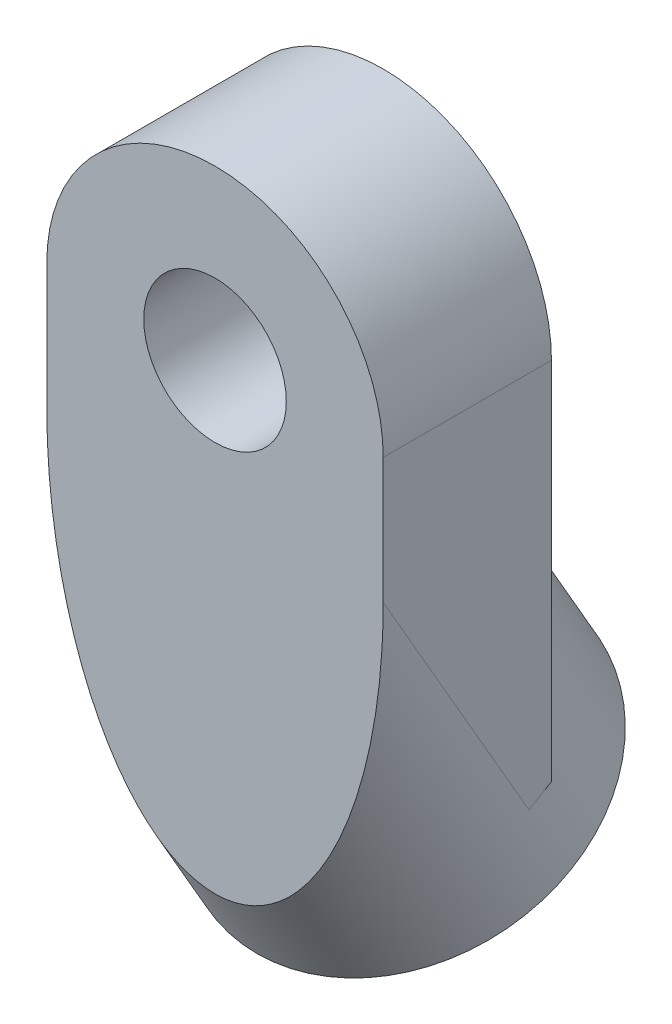
ISO-10303-21;
HEADER;
FILE_DESCRIPTION(('STEP AP214'),'2;1');
FILE_NAME('part.step','',(''),(''),'','','');
FILE_SCHEMA(('AUTOMOTIVE_DESIGN { 1 0 10303 214 1 1 1 1 }'));
ENDSEC;
DATA;
#1=APPLICATION_CONTEXT('core data for automotive mechanical design processes');
#2=APPLICATION_PROTOCOL_DEFINITION('international standard','automotive_design',2000,#1);
#3=PRODUCT_CONTEXT('',#1,'mechanical');
#4=PRODUCT('Part','Part','',(#3));
#5=PRODUCT_RELATED_PRODUCT_CATEGORY('part','',(#4));
#6=PRODUCT_DEFINITION_FORMATION('','',#4);
#7=PRODUCT_DEFINITION_CONTEXT('part definition',#1,'design');
#8=PRODUCT_DEFINITION('design','',#6,#7);
#9=PRODUCT_DEFINITION_SHAPE('','',#8);
#10=(LENGTH_UNIT() NAMED_UNIT(*) SI_UNIT(.MILLI.,.METRE.));
#11=(NAMED_UNIT(*) PLANE_ANGLE_UNIT() SI_UNIT($,.RADIAN.));
#12=(NAMED_UNIT(*) SI_UNIT($,.STERADIAN.) SOLID_ANGLE_UNIT());
#13=UNCERTAINTY_MEASURE_WITH_UNIT(LENGTH_MEASURE(1.E-05),#10,'distance_accuracy_value','');
#14=(GEOMETRIC_REPRESENTATION_CONTEXT(3) GLOBAL_UNCERTAINTY_ASSIGNED_CONTEXT((#13)) GLOBAL_UNIT_ASSIGNED_CONTEXT((#10,
#11,#12)) REPRESENTATION_CONTEXT('',''));
#15=CARTESIAN_POINT('',(0.,0.,0.));
#16=DIRECTION('',(0.,0.,1.));
#17=DIRECTION('',(1.,0.,0.));
#18=AXIS2_PLACEMENT_3D('',#15,#16,#17);
#19=CARTESIAN_POINT('',(0.,-6.48160973273944,-7.82352262806237));
#20=DIRECTION('',(0.,0.866025403784438,0.5));
#21=DIRECTION('',(0.,-0.5,0.866025403784439));
#22=AXIS2_PLACEMENT_3D('',#19,#20,#21);
#23=CYLINDRICAL_SURFACE('',#22,12.7);
#24=CARTESIAN_POINT('',(0.,-6.48160973273944,-7.82352262806237));
#25=DIRECTION('',(0.,-0.866025403784438,-0.5));
#26=DIRECTION('',(0.,0.5,-0.866025403784438));
#27=AXIS2_PLACEMENT_3D('',#24,#25,#26);
#28=CIRCLE('',#27,12.7);
#29=CARTESIAN_POINT('',(0.,-0.13160973273944,-18.8220452561247));
#30=VERTEX_POINT('',#29);
#31=EDGE_CURVE('E107',#30,#30,#28,.T.);
#32=ORIENTED_EDGE('',*,*,#31,.F.);
#33=EDGE_LOOP('',(#32));
#34=FACE_BOUND('',#33,.T.);
#35=CARTESIAN_POINT('',(0.,-3.92939367483299,-6.35));
#36=DIRECTION('',(0.,0.,1.));
#37=DIRECTION('',(0.,-1.,0.));
#38=AXIS2_PLACEMENT_3D('',#35,#36,#37);
#39=ELLIPSE('',#38,25.4,12.7);
#40=CARTESIAN_POINT('',(-9.73055161849106,12.3931508816853,-6.35));
#41=VERTEX_POINT('',#40);
#42=CARTESIAN_POINT('',(-12.5471098798506,0.,-6.35));
#43=VERTEX_POINT('',#42);
#44=EDGE_CURVE('E249',#41,#43,#39,.T.);
#45=ORIENTED_EDGE('',*,*,#44,.F.);
#46=CARTESIAN_POINT('',(-4.71033769559164,15.760829647601,-2.11427145520557));
#47=CARTESIAN_POINT('',(-9.3500188090878,17.6138166245747,-4.53215426220502));
#48=CARTESIAN_POINT('',(-10.9907879563805,12.3158326297928,-4.31861027030312));
#49=CARTESIAN_POINT('',(-4.66480935233403,15.7426480037525,-2.25607684625016));
#50=CARTESIAN_POINT('',(-9.22047598769822,17.5414678862771,-4.70719084140343));
#51=CARTESIAN_POINT('',(-10.8845551554597,12.3270716351925,-4.52397033300249));
#52=CARTESIAN_POINT('',(-4.61729978227359,15.7239778387766,-2.39649452106062));
#53=CARTESIAN_POINT('',(-9.08859857805098,17.4687020364745,-4.87938504399554));
#54=CARTESIAN_POINT('',(-10.7736994919871,12.3371121235453,-4.72705138786155));
#55=CARTESIAN_POINT('',(-4.51829924721504,15.6858160990841,-2.67434319971112));
#56=CARTESIAN_POINT('',(-8.82191939606875,17.3238109959776,-5.21571524870859));
#57=CARTESIAN_POINT('',(-10.5426982435122,12.3549892867223,-5.12840152233819));
#58=CARTESIAN_POINT('',(-4.46680793544057,15.6663244528908,-2.81177394207608));
#59=CARTESIAN_POINT('',(-8.68714583902998,17.2516701468663,-5.37997893006667));
#60=CARTESIAN_POINT('',(-10.4225518493649,12.3628257693199,-5.32667018085616));
#61=CARTESIAN_POINT('',(-4.30611432486,15.6067700492994,-3.2198188508936));
#62=CARTESIAN_POINT('',(-8.28049528887311,17.0379049566083,-5.8587359847489));
#63=CARTESIAN_POINT('',(-10.0476000913328,12.3833459959327,-5.91466891850728));
#64=CARTESIAN_POINT('',(-4.19088889029374,15.5657077333361,-3.48557106919732));
#65=CARTESIAN_POINT('',(-8.00135743649745,16.8961594820296,-6.16580628335845));
#66=CARTESIAN_POINT('',(-9.77874074401754,12.3929936042705,-6.29670210873674));
#67=CARTESIAN_POINT('',(-3.94264342158998,15.4817783554193,-4.00475951743109));
#68=CARTESIAN_POINT('',(-7.42618828043631,16.6179084012312,-6.75403186851694));
#69=CARTESIAN_POINT('',(-9.1995013170445,12.405785747898,-7.04156512632309));
#70=CARTESIAN_POINT('',(-3.80941671213504,15.4388950336906,-4.25799740804109));
#71=CARTESIAN_POINT('',(-7.12994902814984,16.4811257004839,-7.03596818750109));
#72=CARTESIAN_POINT('',(-8.88863899497933,12.4088464699039,-7.40409087337854));
#73=CARTESIAN_POINT('',(-3.52604051870766,15.353416413283,-4.74487346784235));
#74=CARTESIAN_POINT('',(-6.52224331382657,16.2175906140569,-7.56937642180235));
#75=CARTESIAN_POINT('',(-8.22742787699442,12.409780402126,-8.09985919003638));
#76=CARTESIAN_POINT('',(-3.37591031714585,15.3108208440117,-4.97853344982408));
#77=CARTESIAN_POINT('',(-6.21072347010092,16.0904095650642,-7.82196372671173));
#78=CARTESIAN_POINT('',(-7.87712407336615,12.4076594671815,-8.43313436946408));
#79=CARTESIAN_POINT('',(-3.02253444365894,15.2182890169732,-5.4719079638147));
#80=CARTESIAN_POINT('',(-5.50002748537113,15.8224343974878,-8.34719458565854));
#81=CARTESIAN_POINT('',(-7.05258036850595,12.3989491044213,-9.13579984787295));
#82=CARTESIAN_POINT('',(-2.8149172458731,15.1688402279992,-5.72577137924307));
#83=CARTESIAN_POINT('',(-5.09433225766359,15.683343349462,-8.61508186066678));
#84=CARTESIAN_POINT('',(-6.56814024024492,12.3914668031595,-9.49661047976246));
#85=CARTESIAN_POINT('',(-2.37407090860399,15.0768623111116,-6.18644765555731));
#86=CARTESIAN_POINT('',(-4.2556260582803,15.4315524614396,-9.09500944061571));
#87=CARTESIAN_POINT('',(-5.53949878686779,12.3742219941965,-10.150452463801));
#88=CARTESIAN_POINT('',(-2.14094523661842,15.0343068471481,-6.39344085241513));
#89=CARTESIAN_POINT('',(-3.82170830445291,15.3177164813835,-9.30935374707964));
#90=CARTESIAN_POINT('',(-4.99553888591127,12.3644685294358,-10.443743676303));
#91=CARTESIAN_POINT('',(-1.6941915142035,14.9668776396867,-6.71624881522884));
#92=CARTESIAN_POINT('',(-3.0048693398018,15.1407073859371,-9.64060877172266));
#93=CARTESIAN_POINT('',(-3.95311353275647,12.3475207796026,-10.9007044229777));
#94=CARTESIAN_POINT('',(-1.48446513837053,14.9402054421916,-6.84173107168085));
#95=CARTESIAN_POINT('',(-2.62638290015753,15.0716792679719,-9.76892789562338));
#96=CARTESIAN_POINT('',(-3.46375198821261,12.340179786846,-11.0781483587923));
#97=CARTESIAN_POINT('',(-1.16070952942064,14.9076967092268,-6.99346747976409));
#98=CARTESIAN_POINT('',(-2.0471584062177,14.9883331019495,-9.92341577144674));
#99=CARTESIAN_POINT('',(-2.70832223459052,12.3308847245414,-11.2926147283601));
#100=CARTESIAN_POINT('',(-1.05131636180754,14.8981131105382,-7.03795289039113));
#101=CARTESIAN_POINT('',(-1.85263894771915,14.9639249808831,-9.96856674870955));
#102=CARTESIAN_POINT('',(-2.45307151068981,12.328073351361,-11.3554696838678));
#103=CARTESIAN_POINT('',(-0.830075308764096,14.8816829954003,-7.11398329508248));
#104=CARTESIAN_POINT('',(-1.46073522732757,14.9222527103613,-10.0455677648978));
#105=CARTESIAN_POINT('',(-1.93684238730897,12.3231855883868,-11.462875142464));
#106=CARTESIAN_POINT('',(-0.718228566408454,14.8748352317912,-7.14553418565822));
#107=CARTESIAN_POINT('',(-1.2631346432319,14.904936531915,-10.0775143333029));
#108=CARTESIAN_POINT('',(-1.67586665500344,12.3211088637453,-11.5074339862887));
#109=CARTESIAN_POINT('',(-0.505522834831185,14.8646808796553,-7.19223928179345));
#110=CARTESIAN_POINT('',(-0.888300134198296,14.8793298070923,-10.1247272180459));
#111=CARTESIAN_POINT('',(-1.17955328122804,12.3180060208047,-11.5733877971141));
#112=CARTESIAN_POINT('',(-0.404839136592086,14.8610631630283,-7.20883606977078));
#113=CARTESIAN_POINT('',(-0.711132139366061,14.8702222998375,-10.1415040256966));
#114=CARTESIAN_POINT('',(-0.94462465203126,12.3168881640456,-11.5968208966282));
#115=CARTESIAN_POINT('',(-0.202773320352367,14.856227879363,-7.23100643718077));
#116=CARTESIAN_POINT('',(-0.35606895402545,14.8580678883356,-10.1638891610768));
#117=CARTESIAN_POINT('',(-0.473137747504206,12.315390567966,-11.6281222911971));
#118=CARTESIAN_POINT('',(-0.101391056044541,14.8550108314613,-7.23657763236637));
#119=CARTESIAN_POINT('',(-0.177997320138184,14.8550101600694,-10.1695174288209));
#120=CARTESIAN_POINT('',(-0.23657913079045,12.3150109882957,-11.6359872196878));
#121=CARTESIAN_POINT('',(0.120844061844924,14.8550116673593,-7.23657460564745));
#122=CARTESIAN_POINT('',(0.212148123406552,14.8550124675654,-10.1695134618562));
#123=CARTESIAN_POINT('',(0.281969477661819,12.3150114804344,-11.6359830179198));
#124=CARTESIAN_POINT('',(0.241700612642234,14.8567415203758,-7.22865693144764));
#125=CARTESIAN_POINT('',(0.424470037633381,14.8593592852235,-10.161512740725));
#126=CARTESIAN_POINT('',(0.563968096247139,12.3155512724541,-11.6248056193056));
#127=CARTESIAN_POINT('',(0.482325368486037,14.8636021678432,-7.19718573370158));
#128=CARTESIAN_POINT('',(0.847450267656255,14.8766121524747,-10.1297325648991));
#129=CARTESIAN_POINT('',(1.12542585971853,12.3176720415859,-11.5803715179889));
#130=CARTESIAN_POINT('',(0.602092951641436,14.8687347953492,-7.17362378266345));
#131=CARTESIAN_POINT('',(1.05840467528961,14.8895472513431,-10.1058995763168));
#132=CARTESIAN_POINT('',(1.40488355352523,12.3192535798776,-11.5471029148668));
#133=CARTESIAN_POINT('',(0.839624355695914,14.882236953042,-7.11140976282716));
#134=CARTESIAN_POINT('',(1.47758583845933,14.9236507952822,-10.042980665647));
#135=CARTESIAN_POINT('',(1.95912349631825,12.3233474635332,-11.4592387171563));
#136=CARTESIAN_POINT('',(0.957384465011841,14.8906119164125,-7.07273236403171));
#137=CARTESIAN_POINT('',(1.68608462902913,14.9448796269528,-10.0037830493633));
#138=CARTESIAN_POINT('',(2.23389708494462,12.3258613709699,-11.404607323378));
#139=CARTESIAN_POINT('',(1.18984741096279,14.9103331795543,-6.98118330208817));
#140=CARTESIAN_POINT('',(2.09901663990741,14.9950544802912,-9.91096534271956));
#141=CARTESIAN_POINT('',(2.77631062565951,12.3316448325227,-11.2752539864692));
#142=CARTESIAN_POINT('',(1.30454865017269,14.9216809996024,-6.92830437613103));
#143=CARTESIAN_POINT('',(2.3036959484259,15.0240690120957,-9.85721782737466));
#144=CARTESIAN_POINT('',(3.0439468504226,12.3349147731627,-11.2005217635354));
#145=CARTESIAN_POINT('',(1.52904777330116,14.9468927266814,-6.81004367980378));
#146=CARTESIAN_POINT('',(2.70615926291516,15.088863791374,-9.73689605878003));
#147=CARTESIAN_POINT('',(3.56777813768324,12.3419550042145,-11.0333199166134));
#148=CARTESIAN_POINT('',(1.63888202999367,14.9607315633099,-6.7447861680207));
#149=CARTESIAN_POINT('',(2.90420900536596,15.1246539503386,-9.67030449799901));
#150=CARTESIAN_POINT('',(3.82405806998595,12.3457202166542,-10.9410265484126));
#151=CARTESIAN_POINT('',(1.85433289396668,14.9906452409184,-6.60260308027123));
#152=CARTESIAN_POINT('',(3.29504195202557,15.2025263992439,-9.52497541160767));
#153=CARTESIAN_POINT('',(4.32677675258547,12.3535345015855,-10.7398413857879));
#154=CARTESIAN_POINT('',(1.95994783859798,15.0067209523833,-6.52567296082361));
#155=CARTESIAN_POINT('',(3.48799419931685,15.2446936346676,-9.44607654069191));
#156=CARTESIAN_POINT('',(4.57321162336753,12.357583684279,-10.6309431279444));
#157=CARTESIAN_POINT('',(2.26977612464538,15.057736343387,-6.27925068618567));
#158=CARTESIAN_POINT('',(4.06040941546739,15.380097584884,-9.19178907178296));
#159=CARTESIAN_POINT('',(5.29614429078336,12.3697728394588,-10.2819273406455));
#160=CARTESIAN_POINT('',(2.46718194423445,15.0954889264264,-6.09401292227281));
#161=CARTESIAN_POINT('',(4.43028599042624,15.4817989010259,-8.99960587582389));
#162=CARTESIAN_POINT('',(5.75675786986549,12.3779618554567,-10.0193282197027));
#163=CARTESIAN_POINT('',(2.93505330971796,15.1954893619438,-5.59061666535955));
#164=CARTESIAN_POINT('',(5.32864198762943,15.7581273197385,-8.47179346420005));
#165=CARTESIAN_POINT('',(6.84845772269752,12.3959779181049,-9.30464852936331));
#166=CARTESIAN_POINT('',(3.19360940010713,15.2606430314266,-5.25192910930617));
#167=CARTESIAN_POINT('',(5.84101612401426,15.9439606558094,-8.11198048421233));
#168=CARTESIAN_POINT('',(7.45175526690321,12.4046249024233,-8.82294873726217));
#169=CARTESIAN_POINT('',(3.54952450466977,15.360499752124,-4.7041240601667));
#170=CARTESIAN_POINT('',(6.57154521669384,16.2389652263538,-7.52586687605216));
#171=CARTESIAN_POINT('',(8.28222384423621,12.4095865164452,-8.04159777667513));
#172=CARTESIAN_POINT('',(3.66309689941545,15.3942303700317,-4.5143466537726));
#173=CARTESIAN_POINT('',(6.81261434607284,16.3419226055766,-7.31881040630066));
#174=CARTESIAN_POINT('',(8.54722609866195,12.4098958406162,-7.7705637339868));
#175=CARTESIAN_POINT('',(3.87972446265301,15.4615997190231,-4.12334221716234));
#176=CARTESIAN_POINT('',(7.28539619672207,16.5531258973705,-6.88720026771399));
#177=CARTESIAN_POINT('',(9.05269041283687,12.4070591857654,-7.21128407737419));
#178=CARTESIAN_POINT('',(3.98278256468863,15.4952384731741,-3.9221184050934));
#179=CARTESIAN_POINT('',(7.51713767698742,16.6615677072587,-6.66211693626811));
#180=CARTESIAN_POINT('',(9.29315931752144,12.4039141734191,-6.92304329999319));
#181=CARTESIAN_POINT('',(4.206870291917,15.5712716148739,-3.45024684296333));
#182=CARTESIAN_POINT('',(8.03953807239044,16.9151358030417,-6.1251220512142));
#183=CARTESIAN_POINT('',(9.81603068124973,12.3918840508653,-6.24596438496427));
#184=CARTESIAN_POINT('',(4.32448975867346,15.6133877596977,-3.17633794638621));
#185=CARTESIAN_POINT('',(8.3258179625958,17.0611362425487,-5.80796895647771));
#186=CARTESIAN_POINT('',(10.0904761040417,12.3816030652926,-5.85212207696433));
#187=CARTESIAN_POINT('',(4.54287377397335,15.6947468421869,-2.61479213390993));
#188=CARTESIAN_POINT('',(8.88611503321009,17.3569986141832,-5.14251677968005));
#189=CARTESIAN_POINT('',(10.6000388064173,12.3523852536587,-5.04268423996003));
#190=CARTESIAN_POINT('',(4.64363260771262,15.7339888031422,-2.32715060571035));
#191=CARTESIAN_POINT('',(9.15993240096513,17.5070619805325,-4.79309767364758));
#192=CARTESIAN_POINT('',(10.8351427514576,12.3334455008483,-4.62708139777258));
#193=CARTESIAN_POINT('',(4.82726222599394,15.8077890521717,-1.74339826008062));
#194=CARTESIAN_POINT('',(9.69291260092242,17.8061234344805,-4.06330105671037));
#195=CARTESIAN_POINT('',(11.2636118605256,12.2854711214865,-3.7812788951693));
#196=CARTESIAN_POINT('',(4.9103092159632,15.8423920674631,-1.44740761348925));
#197=CARTESIAN_POINT('',(9.95195523621235,17.9551961841857,-3.68207508849214));
#198=CARTESIAN_POINT('',(11.4573881705455,12.2565442397382,-3.35127756730661));
#199=CARTESIAN_POINT('',(5.02212075344317,15.890109264212,-0.996535553405927));
#200=CARTESIAN_POINT('',(10.3279355591432,18.1742234901598,-3.08561902062749));
#201=CARTESIAN_POINT('',(11.7182817580517,12.2043267749801,-2.69425415260257));
#202=CARTESIAN_POINT('',(5.05725881482787,15.905314391714,-0.845129269144452));
#203=CARTESIAN_POINT('',(10.4525024501927,18.2472693657138,-2.88023016273598));
#204=CARTESIAN_POINT('',(11.800270567953,12.1854545870816,-2.47328980533217));
#205=CARTESIAN_POINT('',(5.12321379732035,15.934169204928,-0.540187053124256));
#206=CARTESIAN_POINT('',(10.6980333060922,18.3917252952313,-2.45868103760324));
#207=CARTESIAN_POINT('',(11.9541655270969,12.1445548801057,-2.02753801523626));
#208=CARTESIAN_POINT('',(5.15403045843885,15.9478187970448,-0.386650993841602));
#209=CARTESIAN_POINT('',(10.8189154141147,18.4630949552452,-2.24238918978289));
#210=CARTESIAN_POINT('',(12.0260710696979,12.1225271713432,-1.8027503432988));
#211=CARTESIAN_POINT('',(5.18264588856153,15.9606081840461,-0.232151443697982));
#212=CARTESIAN_POINT('',(10.9368249166652,18.5327002708938,-2.02207707319372));
#213=CARTESIAN_POINT('',(12.0928404066436,12.0988163250075,-1.57616978729815));
#214=(BOUNDED_SURFACE() B_SPLINE_SURFACE(3,2,((#46,#47,#48),(#49,#50,#51),(#52,#53,#54),(#55,
#56,#57),(#58,#59,#60),(#61,#62,#63),(#64,#65,#66),(#67,#68,#69),(#70,#71,#72),(#73,#74,#75),
(#76,#77,#78),(#79,#80,#81),(#82,#83,#84),(#85,#86,#87),(#88,#89,#90),(#91,#92,#93),(#94,#95,
#96),(#97,#98,#99),(#100,#101,#102),(#103,#104,#105),(#106,#107,#108),(#109,#110,#111),(#112,
#113,#114),(#115,#116,#117),(#118,#119,#120),(#121,#122,#123),(#124,#125,#126),(#127,#128,#129),
(#130,#131,#132),(#133,#134,#135),(#136,#137,#138),(#139,#140,#141),(#142,#143,#144),(#145,#146,
#147),(#148,#149,#150),(#151,#152,#153),(#154,#155,#156),(#157,#158,#159),(#160,#161,#162),
(#163,#164,#165),(#166,#167,#168),(#169,#170,#171),(#172,#173,#174),(#175,#176,#177),(#178,#179,
#180),(#181,#182,#183),(#184,#185,#186),(#187,#188,#189),(#190,#191,#192),(#193,#194,#195),
(#196,#197,#198),(#199,#200,#201),(#202,#203,#204),(#205,#206,#207),(#208,#209,#210),(#211,#212,
#213)),.UNSPECIFIED.,.F.,.F.,.F.) B_SPLINE_SURFACE_WITH_KNOTS((4,2,2,2,2,2,2,2,2,2,2,2,2,2,2,2,
2,2,2,2,2,2,2,2,2,2,2,4),(3,3),(0.,0.472559011112514,0.945159224610152,1.89240133699951,
2.85162684482873,3.8097690093552,4.98208609386065,6.14981293072542,7.10994395997552,
7.58956323253777,8.06896361535331,8.49457200909475,8.92027242915549,9.42764822635231,
9.935297566289,10.4438012823665,10.9525655493856,11.4564698476179,11.9605707926618,
12.9678355183671,14.4712557436426,15.2269135756544,15.9823599951925,16.9560652687638,
17.930099907968,18.8939386993211,19.3756585119878,19.8574072940386),(0.,1.),
.UNSPECIFIED.) GEOMETRIC_REPRESENTATION_ITEM() RATIONAL_B_SPLINE_SURFACE(((1.,0.675159763860782,
1.),(1.,0.680073877102651,1.),(1.,0.684981388172167,1.),(1.,0.69476508033939,1.),(1.,
0.699641258668131,1.),(1.,0.714215272106078,1.),(1.,0.723837193490227,1.),(1.,0.742830281809362,
1.),(1.,0.752196736568289,1.),(1.,0.770352737941172,1.),(1.,0.77914292416439,1.),(1.,
0.797821558807139,1.),(1.,0.807516290168331,1.),(1.,0.825204094103312,1.),(1.,0.833203680946402,
1.),(1.,0.84572178959545,1.),(1.,0.850606340919013,1.),(1.,0.856522838885887,1.),(1.,
0.858259469363354,1.),(1.,0.861229519861024,1.),(1.,0.862463169175858,1.),(1.,0.864290023559396,
1.),(1.,0.864939558735889,1.),(1.,0.865807324028874,1.),(1.,0.866025460856928,1.),(1.,
0.866025335761956,1.),(1.,0.865715316097067,1.),(1.,0.864483627727086,1.),(1.,0.863561629352282,
1.),(1.,0.861129073017657,1.),(1.,0.859617527120951,1.),(1.,0.856043672928171,1.),(1.,
0.853981082825178,1.),(1.,0.84937478316106,1.),(1.,0.846835857703518,1.),(1.,0.841313579080168,
1.),(1.,0.838330052864729,1.),(1.,0.828792757975062,1.),(1.,0.821647827505717,1.),(1.,
0.802341190713796,1.),(1.,0.789441925608556,1.),(1.,0.768837059359542,1.),(1.,0.761739297886217,
1.),(1.,0.747221604905039,1.),(1.,0.739801764087146,1.),(1.,0.722552691146118,1.),(1.,
0.712646695418456,1.),(1.,0.692624480775773,1.),(1.,0.682508191884081,1.),(1.,0.662345069198967,
1.),(1.,0.652298616831969,1.),(1.,0.63734129497248,1.),(1.,0.63237526446365,1.),(1.,
0.622502771568928,1.),(1.,0.617596312783269,1.),(1.,0.612731357942644,1.))) REPRESENTATION_ITEM('') SURFACE());
#215=CARTESIAN_POINT('',(-10.9907879563805,12.3158326297928,-4.31861027030312));
#216=CARTESIAN_POINT('',(-10.8845551554597,12.3270716351925,-4.52397033300249));
#217=CARTESIAN_POINT('',(-10.7736994919871,12.3371121235453,-4.72705138786155));
#218=CARTESIAN_POINT('',(-10.5426982435122,12.3549892867223,-5.12840152233819));
#219=CARTESIAN_POINT('',(-10.4225518493649,12.3628257693199,-5.32667018085616));
#220=CARTESIAN_POINT('',(-10.0476000913329,12.3833459959327,-5.91466891850728));
#221=CARTESIAN_POINT('',(-9.77874074401754,12.3929936042705,-6.29670210873674));
#222=CARTESIAN_POINT('',(-9.1995013170445,12.405785747898,-7.04156512632309));
#223=CARTESIAN_POINT('',(-8.88863899497933,12.4088464699039,-7.40409087337854));
#224=CARTESIAN_POINT('',(-8.22742787699442,12.409780402126,-8.09985919003638));
#225=CARTESIAN_POINT('',(-7.87712407336615,12.4076594671815,-8.43313436946408));
#226=CARTESIAN_POINT('',(-7.05258036850595,12.3989491044213,-9.13579984787295));
#227=CARTESIAN_POINT('',(-6.56814024024492,12.3914668031595,-9.49661047976246));
#228=CARTESIAN_POINT('',(-5.53949878686779,12.3742219941965,-10.150452463801));
#229=CARTESIAN_POINT('',(-4.99553888591127,12.3644685294358,-10.443743676303));
#230=CARTESIAN_POINT('',(-3.95311353275647,12.3475207796026,-10.9007044229777));
#231=CARTESIAN_POINT('',(-3.46375198821261,12.340179786846,-11.0781483587923));
#232=CARTESIAN_POINT('',(-2.70832223459052,12.3308847245414,-11.2926147283601));
#233=CARTESIAN_POINT('',(-2.45307151068981,12.328073351361,-11.3554696838678));
#234=CARTESIAN_POINT('',(-1.93684238730897,12.3231855883868,-11.462875142464));
#235=CARTESIAN_POINT('',(-1.67586665500344,12.3211088637453,-11.5074339862887));
#236=CARTESIAN_POINT('',(-1.17955328122804,12.3180060208047,-11.5733877971141));
#237=CARTESIAN_POINT('',(-0.94462465203126,12.3168881640456,-11.5968208966282));
#238=CARTESIAN_POINT('',(-0.473137747504206,12.315390567966,-11.6281222911971));
#239=CARTESIAN_POINT('',(-0.23657913079045,12.3150109882957,-11.6359872196878));
#240=CARTESIAN_POINT('',(0.281969477661819,12.3150114804344,-11.6359830179198));
#241=CARTESIAN_POINT('',(0.563968096247139,12.3155512724541,-11.6248056193056));
#242=CARTESIAN_POINT('',(1.12542585971853,12.3176720415859,-11.5803715179889));
#243=CARTESIAN_POINT('',(1.40488355352523,12.3192535798776,-11.5471029148668));
#244=CARTESIAN_POINT('',(1.95912349631825,12.3233474635332,-11.4592387171563));
#245=CARTESIAN_POINT('',(2.23389708494462,12.3258613709699,-11.404607323378));
#246=CARTESIAN_POINT('',(2.77631062565951,12.3316448325227,-11.2752539864692));
#247=CARTESIAN_POINT('',(3.0439468504226,12.3349147731627,-11.2005217635354));
#248=CARTESIAN_POINT('',(3.56777813768324,12.3419550042145,-11.0333199166134));
#249=CARTESIAN_POINT('',(3.82405806998595,12.3457202166542,-10.9410265484126));
#250=CARTESIAN_POINT('',(4.32677675258547,12.3535345015855,-10.7398413857879));
#251=CARTESIAN_POINT('',(4.57321162336753,12.357583684279,-10.6309431279444));
#252=CARTESIAN_POINT('',(5.29614429078336,12.3697728394588,-10.2819273406455));
#253=CARTESIAN_POINT('',(5.75675786986549,12.3779618554567,-10.0193282197027));
#254=CARTESIAN_POINT('',(6.84845772269753,12.3959779181049,-9.30464852936331));
#255=CARTESIAN_POINT('',(7.45175526690321,12.4046249024233,-8.82294873726217));
#256=CARTESIAN_POINT('',(8.28222384423621,12.4095865164452,-8.04159777667513));
#257=CARTESIAN_POINT('',(8.54722609866195,12.4098958406162,-7.7705637339868));
#258=CARTESIAN_POINT('',(9.05269041283687,12.4070591857654,-7.21128407737419));
#259=CARTESIAN_POINT('',(9.29315931752144,12.4039141734191,-6.92304329999319));
#260=CARTESIAN_POINT('',(9.81603068124973,12.3918840508653,-6.24596438496427));
#261=CARTESIAN_POINT('',(10.0904761040417,12.3816030652926,-5.85212207696433));
#262=CARTESIAN_POINT('',(10.6000388064173,12.3523852536587,-5.04268423996003));
#263=CARTESIAN_POINT('',(10.8351427514576,12.3334455008483,-4.62708139777258));
#264=CARTESIAN_POINT('',(11.2636118605256,12.2854711214865,-3.7812788951693));
#265=CARTESIAN_POINT('',(11.4573881705455,12.2565442397382,-3.35127756730661));
#266=CARTESIAN_POINT('',(11.7182817580517,12.2043267749801,-2.69425415260257));
#267=CARTESIAN_POINT('',(11.800270567953,12.1854545870816,-2.47328980533217));
#268=CARTESIAN_POINT('',(11.9541655270969,12.1445548801057,-2.02753801523626));
#269=CARTESIAN_POINT('',(12.0260710696979,12.1225271713432,-1.8027503432988));
#270=CARTESIAN_POINT('',(12.0928404066436,12.0988163250075,-1.57616978729815));
#271=B_SPLINE_CURVE_WITH_KNOTS('',3,(#215,#216,#217,#218,#219,#220,#221,#222,#223,#224,#225,
#226,#227,#228,#229,#230,#231,#232,#233,#234,#235,#236,#237,#238,#239,#240,#241,#242,#243,#244,
#245,#246,#247,#248,#249,#250,#251,#252,#253,#254,#255,#256,#257,#258,#259,#260,#261,#262,#263,
#264,#265,#266,#267,#268,#269,#270),.UNSPECIFIED.,.F.,.F.,(4,2,2,2,2,2,2,2,2,2,2,2,2,2,2,2,2,2,
2,2,2,2,2,2,2,2,2,4),(0.,0.472559011112514,0.945159224610152,1.89240133699951,2.85162684482873,
3.8097690093552,4.98208609386065,6.14981293072542,7.10994395997552,7.58956323253777,
8.06896361535331,8.49457200909475,8.92027242915549,9.42764822635231,9.935297566289,
10.4438012823665,10.9525655493856,11.4564698476179,11.9605707926618,12.9678355183671,
14.4712557436426,15.2269135756544,15.9823599951925,16.9560652687638,17.930099907968,
18.8939386993211,19.3756585119878,19.8574072940386),.UNSPECIFIED.);
#272=CARTESIAN_POINT('',(9.73055161849106,12.3931508816853,-6.35));
#273=VERTEX_POINT('',#272);
#274=EDGE_CURVE('E44',#41,#273,#271,.T.);
#275=ORIENTED_EDGE('',*,*,#274,.T.);
#276=CARTESIAN_POINT('',(12.5471098798506,0.,-6.35));
#277=VERTEX_POINT('',#276);
#278=EDGE_CURVE('E98',#277,#273,#39,.T.);
#279=ORIENTED_EDGE('',*,*,#278,.F.);
#280=CARTESIAN_POINT('',(0.,-0.982348418708253,-4.64852262806237));
#281=DIRECTION('',(0.,-0.866025403784438,-0.5));
#282=DIRECTION('',(0.,0.5,-0.866025403784438));
#283=AXIS2_PLACEMENT_3D('',#280,#281,#282);
#284=CIRCLE('',#283,12.7);
#285=CARTESIAN_POINT('',(12.7,-0.982348418708251,-4.64852262806237));
#286=VERTEX_POINT('',#285);
#287=EDGE_CURVE('E102',#277,#286,#284,.T.);
#288=ORIENTED_EDGE('',*,*,#287,.T.);
#289=DIRECTION('',(0.,-0.866025403784438,-0.5));
#290=VECTOR('',#289,1.);
#291=CARTESIAN_POINT('',(12.7,21.0146968374165,8.05147737193765));
#292=LINE('',#291,#290);
#293=CARTESIAN_POINT('',(12.7,18.0676515812917,6.35));
#294=VERTEX_POINT('',#293);
#295=EDGE_CURVE('E88',#294,#286,#292,.T.);
#296=ORIENTED_EDGE('',*,*,#295,.F.);
#297=CARTESIAN_POINT('',(0.,18.0676515812917,6.35));
#298=DIRECTION('',(0.,0.,1.));
#299=DIRECTION('',(0.,-1.,0.));
#300=AXIS2_PLACEMENT_3D('',#297,#298,#299);
#301=ELLIPSE('',#300,25.4,12.7);
#302=CARTESIAN_POINT('',(-12.7,18.0676515812917,6.35));
#303=VERTEX_POINT('',#302);
#304=EDGE_CURVE('E224',#303,#294,#301,.T.);
#305=ORIENTED_EDGE('',*,*,#304,.F.);
#306=DIRECTION('',(0.,-0.866025403784438,-0.5));
#307=VECTOR('',#306,1.);
#308=CARTESIAN_POINT('',(-12.7,21.0146968374165,8.05147737193765));
#309=LINE('',#308,#307);
#310=CARTESIAN_POINT('',(-12.7,-0.982348418708254,-4.64852262806237));
#311=VERTEX_POINT('',#310);
#312=EDGE_CURVE('E97',#303,#311,#309,.T.);
#313=ORIENTED_EDGE('',*,*,#312,.T.);
#314=EDGE_CURVE('E112',#311,#43,#284,.T.);
#315=ORIENTED_EDGE('',*,*,#314,.T.);
#316=EDGE_LOOP('',(#45,#275,#279,#288,#296,#305,#313,#315));
#317=FACE_BOUND('',#316,.T.);
#318=ADVANCED_FACE('F17',(#34,#317),#23,.T.);
#319=CARTESIAN_POINT('',(0.,20.1275056064129,6.35));
#320=DIRECTION('',(0.,0.,1.));
#321=DIRECTION('',(1.,0.,0.));
#322=AXIS2_PLACEMENT_3D('',#319,#320,#321);
#323=PLANE('',#322);
#324=CARTESIAN_POINT('',(0.,27.5550112128258,6.35));
#325=DIRECTION('',(0.,0.,1.));
#326=DIRECTION('',(1.,0.,0.));
#327=AXIS2_PLACEMENT_3D('',#324,#325,#326);
#328=CIRCLE('',#327,5.38033465621192);
#329=CARTESIAN_POINT('',(5.38033465621192,27.5550112128258,6.35));
#330=VERTEX_POINT('',#329);
#331=EDGE_CURVE('E110',#330,#330,#328,.T.);
#332=ORIENTED_EDGE('',*,*,#331,.F.);
#333=EDGE_LOOP('',(#332));
#334=FACE_BOUND('',#333,.T.);
#335=ORIENTED_EDGE('',*,*,#304,.T.);
#336=DIRECTION('',(0.,1.,0.));
#337=VECTOR('',#336,1.);
#338=CARTESIAN_POINT('',(12.7,13.7775056064129,6.35));
#339=LINE('',#338,#337);
#340=CARTESIAN_POINT('',(12.7,27.5550112128258,6.35));
#341=VERTEX_POINT('',#340);
#342=EDGE_CURVE('E94',#294,#341,#339,.T.);
#343=ORIENTED_EDGE('',*,*,#342,.T.);
#344=CARTESIAN_POINT('',(0.,27.5550112128258,6.35));
#345=DIRECTION('',(0.,0.,1.));
#346=DIRECTION('',(1.,0.,0.));
#347=AXIS2_PLACEMENT_3D('',#344,#345,#346);
#348=CIRCLE('',#347,12.7);
#349=CARTESIAN_POINT('',(-12.7,27.5550112128258,6.35));
#350=VERTEX_POINT('',#349);
#351=EDGE_CURVE('E139',#341,#350,#348,.T.);
#352=ORIENTED_EDGE('',*,*,#351,.T.);
#353=DIRECTION('',(0.,1.,0.));
#354=VECTOR('',#353,1.);
#355=CARTESIAN_POINT('',(-12.7,13.7775056064129,6.35));
#356=LINE('',#355,#354);
#357=EDGE_CURVE('E220',#303,#350,#356,.T.);
#358=ORIENTED_EDGE('',*,*,#357,.F.);
#359=EDGE_LOOP('',(#335,#343,#352,#358));
#360=FACE_BOUND('',#359,.T.);
#361=ADVANCED_FACE('F178',(#334,#360),#323,.T.);
#362=CARTESIAN_POINT('',(-12.7,-3.66617420935414,0.));
#363=DIRECTION('',(0.,-0.866025403784438,-0.5));
#364=DIRECTION('',(0.,0.5,-0.866025403784439));
#365=AXIS2_PLACEMENT_3D('',#362,#363,#364);
#366=PLANE('',#365);
#367=ORIENTED_EDGE('',*,*,#287,.F.);
#368=DIRECTION('',(1.,0.,0.));
#369=VECTOR('',#368,1.);
#370=CARTESIAN_POINT('',(0.,0.,-6.35));
#371=LINE('',#370,#369);
#372=CARTESIAN_POINT('',(12.7,0.,-6.35));
#373=VERTEX_POINT('',#372);
#374=EDGE_CURVE('E104',#277,#373,#371,.T.);
#375=ORIENTED_EDGE('',*,*,#374,.T.);
#376=DIRECTION('',(0.,0.5,-0.866025403784438));
#377=VECTOR('',#376,1.);
#378=CARTESIAN_POINT('',(12.7,-3.66617420935413,0.));
#379=LINE('',#378,#377);
#380=EDGE_CURVE('E91',#286,#373,#379,.T.);
#381=ORIENTED_EDGE('',*,*,#380,.F.);
#382=EDGE_LOOP('',(#367,#375,#381));
#383=FACE_BOUND('',#382,.T.);
#384=ADVANCED_FACE('F101',(#383),#366,.T.);
#385=CARTESIAN_POINT('',(-12.7,13.7775056064129,6.35));
#386=DIRECTION('',(-1.,0.,0.));
#387=DIRECTION('',(0.,-1.,0.));
#388=AXIS2_PLACEMENT_3D('',#385,#386,#387);
#389=PLANE('',#388);
#390=ORIENTED_EDGE('',*,*,#312,.F.);
#391=ORIENTED_EDGE('',*,*,#357,.T.);
#392=DIRECTION('',(0.,0.,-1.));
#393=VECTOR('',#392,1.);
#394=CARTESIAN_POINT('',(-12.7,27.5550112128258,6.35));
#395=LINE('',#394,#393);
#396=CARTESIAN_POINT('',(-12.7,27.5550112128258,-6.35));
#397=VERTEX_POINT('',#396);
#398=EDGE_CURVE('E132',#350,#397,#395,.T.);
#399=ORIENTED_EDGE('',*,*,#398,.T.);
#400=DIRECTION('',(0.,1.,0.));
#401=VECTOR('',#400,1.);
#402=CARTESIAN_POINT('',(-12.7,13.7775056064129,-6.35));
#403=LINE('',#402,#401);
#404=CARTESIAN_POINT('',(-12.7,0.,-6.35));
#405=VERTEX_POINT('',#404);
#406=EDGE_CURVE('E238',#405,#397,#403,.T.);
#407=ORIENTED_EDGE('',*,*,#406,.F.);
#408=DIRECTION('',(0.,0.5,-0.866025403784438));
#409=VECTOR('',#408,1.);
#410=CARTESIAN_POINT('',(-12.7,-3.66617420935414,0.));
#411=LINE('',#410,#409);
#412=EDGE_CURVE('E106',#311,#405,#411,.T.);
#413=ORIENTED_EDGE('',*,*,#412,.F.);
#414=EDGE_LOOP('',(#390,#391,#399,#407,#413));
#415=FACE_BOUND('',#414,.T.);
#416=ADVANCED_FACE('F210',(#415),#389,.T.);
#417=CARTESIAN_POINT('',(12.7,13.7775056064129,6.35));
#418=DIRECTION('',(-1.,0.,0.));
#419=DIRECTION('',(0.,-1.,0.));
#420=AXIS2_PLACEMENT_3D('',#417,#418,#419);
#421=PLANE('',#420);
#422=ORIENTED_EDGE('',*,*,#342,.F.);
#423=ORIENTED_EDGE('',*,*,#295,.T.);
#424=ORIENTED_EDGE('',*,*,#380,.T.);
#425=DIRECTION('',(0.,1.,0.));
#426=VECTOR('',#425,1.);
#427=CARTESIAN_POINT('',(12.7,13.7775056064129,-6.35));
#428=LINE('',#427,#426);
#429=CARTESIAN_POINT('',(12.7,27.5550112128258,-6.35));
#430=VERTEX_POINT('',#429);
#431=EDGE_CURVE('E234',#373,#430,#428,.T.);
#432=ORIENTED_EDGE('',*,*,#431,.T.);
#433=DIRECTION('',(0.,0.,-1.));
#434=VECTOR('',#433,1.);
#435=CARTESIAN_POINT('',(12.7,27.5550112128258,6.35));
#436=LINE('',#435,#434);
#437=EDGE_CURVE('E125',#341,#430,#436,.T.);
#438=ORIENTED_EDGE('',*,*,#437,.F.);
#439=EDGE_LOOP('',(#422,#423,#424,#432,#438));
#440=FACE_BOUND('',#439,.T.);
#441=ADVANCED_FACE('F90',(#440),#421,.F.);
#442=CARTESIAN_POINT('',(0.,27.5550112128258,6.35));
#443=DIRECTION('',(0.,0.,-1.));
#444=DIRECTION('',(-1.,0.,0.));
#445=AXIS2_PLACEMENT_3D('',#442,#443,#444);
#446=CYLINDRICAL_SURFACE('',#445,12.7);
#447=CARTESIAN_POINT('',(0.,27.5550112128258,-6.35));
#448=DIRECTION('',(0.,0.,1.));
#449=DIRECTION('',(1.,0.,0.));
#450=AXIS2_PLACEMENT_3D('',#447,#448,#449);
#451=CIRCLE('',#450,12.7);
#452=EDGE_CURVE('E229',#430,#397,#451,.T.);
#453=ORIENTED_EDGE('',*,*,#452,.T.);
#454=ORIENTED_EDGE('',*,*,#398,.F.);
#455=ORIENTED_EDGE('',*,*,#351,.F.);
#456=ORIENTED_EDGE('',*,*,#437,.T.);
#457=EDGE_LOOP('',(#453,#454,#455,#456));
#458=FACE_BOUND('',#457,.T.);
#459=ADVANCED_FACE('F193',(#458),#446,.T.);
#460=CARTESIAN_POINT('',(0.,20.1275056064129,-6.35));
#461=DIRECTION('',(0.,0.,1.));
#462=DIRECTION('',(1.,0.,0.));
#463=AXIS2_PLACEMENT_3D('',#460,#461,#462);
#464=PLANE('',#463);
#465=ORIENTED_EDGE('',*,*,#278,.T.);
#466=CARTESIAN_POINT('',(9.73055161849106,12.3931508816853,-6.35));
#467=CARTESIAN_POINT('',(9.68192617307924,12.5091749235922,-6.35));
#468=CARTESIAN_POINT('',(9.62807547066557,12.6229938328577,-6.35));
#469=CARTESIAN_POINT('',(9.51053123611956,12.8453754120495,-6.35));
#470=CARTESIAN_POINT('',(9.44684158311006,12.9539401314436,-6.35));
#471=CARTESIAN_POINT('',(9.31053647531612,13.1645214516799,-6.35));
#472=CARTESIAN_POINT('',(9.23796820466663,13.266568627555,-6.35));
#473=CARTESIAN_POINT('',(9.08434463955247,13.4640611538207,-6.35));
#474=CARTESIAN_POINT('',(9.00328885728634,13.5595061242398,-6.35));
#475=CARTESIAN_POINT('',(8.83356583738586,13.7431203591997,-6.35));
#476=CARTESIAN_POINT('',(8.74490942879325,13.8312996352943,-6.35));
#477=CARTESIAN_POINT('',(8.56068142538921,14.0001353941073,-6.35));
#478=CARTESIAN_POINT('',(8.46510721199778,14.0807890014286,-6.35));
#479=CARTESIAN_POINT('',(8.16909117555818,14.3110772704823,-6.35));
#480=CARTESIAN_POINT('',(7.95938484693238,14.4490084667865,-6.35));
#481=CARTESIAN_POINT('',(7.50926388979107,14.6996052368284,-6.35));
#482=CARTESIAN_POINT('',(7.26776689868973,14.8102960804823,-6.35));
#483=CARTESIAN_POINT('',(6.77181638088228,14.9963634488015,-6.35));
#484=CARTESIAN_POINT('',(6.51736916426835,15.0717569931069,-6.35));
#485=CARTESIAN_POINT('',(6.05492096232721,15.1776299212064,-6.35));
#486=CARTESIAN_POINT('',(5.84825764770181,15.2141873580908,-6.35));
#487=CARTESIAN_POINT('',(5.43241947490624,15.2686850707104,-6.35));
#488=CARTESIAN_POINT('',(5.22324337144174,15.2866156948347,-6.35));
#489=CARTESIAN_POINT('',(4.80325068168298,15.3059910611095,-6.35));
#490=CARTESIAN_POINT('',(4.59243095516294,15.3073608409595,-6.35));
#491=CARTESIAN_POINT('',(4.17117543532835,15.295894855271,-6.35));
#492=CARTESIAN_POINT('',(3.96073975298629,15.2830554857119,-6.35));
#493=CARTESIAN_POINT('',(3.61821297704493,15.2527682982398,-6.35));
#494=CARTESIAN_POINT('',(3.48579546847315,15.2387563146389,-6.35));
#495=CARTESIAN_POINT('',(3.22141873683336,15.2069807167118,-6.35));
#496=CARTESIAN_POINT('',(3.08945949457393,15.1892172614646,-6.35));
#497=CARTESIAN_POINT('',(2.82727712967505,15.1509910870981,-6.35));
#498=CARTESIAN_POINT('',(2.69704975318272,15.1305568331005,-6.35));
#499=CARTESIAN_POINT('',(2.43692012517178,15.0878864949754,-6.35));
#500=CARTESIAN_POINT('',(2.30701780327444,15.0656508434285,-6.35));
#501=CARTESIAN_POINT('',(2.17719779156836,15.0430245689554,-6.35));
#502=B_SPLINE_CURVE_WITH_KNOTS('',3,(#466,#467,#468,#469,#470,#471,#472,#473,#474,#475,#476,
#477,#478,#479,#480,#481,#482,#483,#484,#485,#486,#487,#488,#489,#490,#491,#492,#493,#494,#495,
#496,#497,#498,#499,#500,#501),.UNSPECIFIED.,.F.,.F.,(4,2,2,2,2,2,2,2,2,2,2,2,2,2,2,2,2,4),(0.,
0.3772580799202,0.754367799196605,1.12955402347303,1.5047618226177,1.8794436542497,
2.25426806256947,3.00404234071561,3.79812402784822,4.59182242958222,5.22056416798695,
5.84963153098502,6.48154529320996,7.11361937131756,7.51303774390453,7.9124391827924,
8.30788636246306,8.70323886087815),.UNSPECIFIED.);
#503=CARTESIAN_POINT('',(2.17719779156836,15.0430245689554,-6.35));
#504=VERTEX_POINT('',#503);
#505=EDGE_CURVE('E11',#273,#504,#502,.T.);
#506=ORIENTED_EDGE('',*,*,#505,.T.);
#507=CARTESIAN_POINT('',(0.,27.5550112128258,-6.35));
#508=DIRECTION('',(0.,0.,-1.));
#509=DIRECTION('',(-1.,0.,0.));
#510=AXIS2_PLACEMENT_3D('',#507,#508,#509);
#511=CIRCLE('',#510,12.7);
#512=CARTESIAN_POINT('',(-2.17719779156836,15.0430245689554,-6.35));
#513=VERTEX_POINT('',#512);
#514=EDGE_CURVE('E253',#504,#513,#511,.T.);
#515=ORIENTED_EDGE('',*,*,#514,.T.);
#516=CARTESIAN_POINT('',(-2.17719779156836,15.0430245689554,-6.35));
#517=CARTESIAN_POINT('',(-2.30571343202841,15.0654210159901,-6.35));
#518=CARTESIAN_POINT('',(-2.43430866975871,15.0874360522659,-6.35));
#519=CARTESIAN_POINT('',(-2.69183581208946,15.129716286238,-6.35));
#520=CARTESIAN_POINT('',(-2.82076782866681,15.1499807963822,-6.35));
#521=CARTESIAN_POINT('',(-3.0796298452721,15.1878393207018,-6.35));
#522=CARTESIAN_POINT('',(-3.20956172148474,15.205420840578,-6.35));
#523=CARTESIAN_POINT('',(-3.46984537106182,15.2369660282643,-6.35));
#524=CARTESIAN_POINT('',(-3.60019709062789,15.2509301422856,-6.35));
#525=CARTESIAN_POINT('',(-3.99630943028524,15.2866374012044,-6.35));
#526=CARTESIAN_POINT('',(-4.26275688335728,15.3015005945296,-6.35));
#527=CARTESIAN_POINT('',(-4.79559442209926,15.3074402371292,-6.35));
#528=CARTESIAN_POINT('',(-5.06198361906977,15.2985627084207,-6.35));
#529=CARTESIAN_POINT('',(-5.48759363210886,15.2615382595913,-6.35));
#530=CARTESIAN_POINT('',(-5.64761053806875,15.2423807474185,-6.35));
#531=CARTESIAN_POINT('',(-5.96595362036049,15.1927605861543,-6.35));
#532=CARTESIAN_POINT('',(-6.12427940061293,15.1622953459198,-6.35));
#533=CARTESIAN_POINT('',(-6.43744655646861,15.0894326808375,-6.35));
#534=CARTESIAN_POINT('',(-6.59230022784339,15.0470885201677,-6.35));
#535=CARTESIAN_POINT('',(-6.89800615420118,14.9497874807585,-6.35));
#536=CARTESIAN_POINT('',(-7.0488587258111,14.8948316033889,-6.35));
#537=CARTESIAN_POINT('',(-7.34711555065313,14.7710647549742,-6.35));
#538=CARTESIAN_POINT('',(-7.4944489232251,14.7020820155305,-6.35));
#539=CARTESIAN_POINT('',(-7.78193724346222,14.5505140824859,-6.35));
#540=CARTESIAN_POINT('',(-7.92209366571464,14.4679316979089,-6.35));
#541=CARTESIAN_POINT('',(-8.1934875789574,14.289251147506,-6.35));
#542=CARTESIAN_POINT('',(-8.32472726807929,14.1931563307939,-6.35));
#543=CARTESIAN_POINT('',(-8.57650479580976,13.9878403097973,-6.35));
#544=CARTESIAN_POINT('',(-8.69704487171567,13.8786218609697,-6.35));
#545=CARTESIAN_POINT('',(-8.9084001873583,13.6652316077009,-6.35));
#546=CARTESIAN_POINT('',(-9.00095722288356,13.5627805760146,-6.35));
#547=CARTESIAN_POINT('',(-9.1760221820649,13.3496459561401,-6.35));
#548=CARTESIAN_POINT('',(-9.25853248388477,13.2389643262486,-6.35));
#549=CARTESIAN_POINT('',(-9.41301906455525,13.0095113202901,-6.35));
#550=CARTESIAN_POINT('',(-9.48492979929152,12.8906957606326,-6.35));
#551=CARTESIAN_POINT('',(-9.61687378621455,12.6465383140973,-6.35));
#552=CARTESIAN_POINT('',(-9.67689861610174,12.5211918783479,-6.35));
#553=CARTESIAN_POINT('',(-9.73055161849106,12.3931508816853,-6.35));
#554=B_SPLINE_CURVE_WITH_KNOTS('',3,(#516,#517,#518,#519,#520,#521,#522,#523,#524,#525,#526,
#527,#528,#529,#530,#531,#532,#533,#534,#535,#536,#537,#538,#539,#540,#541,#542,#543,#544,#545,
#546,#547,#548,#549,#550,#551,#552,#553),.UNSPECIFIED.,.F.,.F.,(4,2,2,2,2,2,2,2,2,2,2,2,2,2,2,2,
2,2,4),(0.,0.39137723266713,0.782907493720345,1.17620879488153,1.56946155874031,
2.36921936109926,3.16742793619945,3.65056032120704,4.13380348345033,4.61491353319249,
5.09598539602114,5.58334758590062,6.07060923647557,6.5577503293511,7.04478931950759,
7.45841585138622,7.87194428254117,8.287931254567,8.70421194652361),.UNSPECIFIED.);
#555=EDGE_CURVE('E31',#513,#41,#554,.T.);
#556=ORIENTED_EDGE('',*,*,#555,.T.);
#557=ORIENTED_EDGE('',*,*,#44,.T.);
#558=EDGE_CURVE('E242',#405,#43,#371,.T.);
#559=ORIENTED_EDGE('',*,*,#558,.F.);
#560=ORIENTED_EDGE('',*,*,#406,.T.);
#561=ORIENTED_EDGE('',*,*,#452,.F.);
#562=ORIENTED_EDGE('',*,*,#431,.F.);
#563=ORIENTED_EDGE('',*,*,#374,.F.);
#564=EDGE_LOOP('',(#465,#506,#515,#556,#557,#559,#560,#561,#562,#563));
#565=FACE_BOUND('',#564,.T.);
#566=CARTESIAN_POINT('',(0.,27.5550112128258,-6.35));
#567=DIRECTION('',(0.,0.,-1.));
#568=DIRECTION('',(-1.,0.,0.));
#569=AXIS2_PLACEMENT_3D('',#566,#567,#568);
#570=CIRCLE('',#569,5.38033465621192);
#571=CARTESIAN_POINT('',(-5.38033465621192,27.5550112128258,-6.35));
#572=VERTEX_POINT('',#571);
#573=EDGE_CURVE('E119',#572,#572,#570,.T.);
#574=ORIENTED_EDGE('',*,*,#573,.F.);
#575=EDGE_LOOP('',(#574));
#576=FACE_BOUND('',#575,.T.);
#577=ADVANCED_FACE('F185',(#565,#576),#464,.F.);
#578=ORIENTED_EDGE('',*,*,#314,.F.);
#579=ORIENTED_EDGE('',*,*,#412,.T.);
#580=ORIENTED_EDGE('',*,*,#558,.T.);
#581=EDGE_LOOP('',(#578,#579,#580));
#582=FACE_BOUND('',#581,.T.);
#583=ADVANCED_FACE('F181',(#582),#366,.T.);
#584=CARTESIAN_POINT('',(0.,-6.48160973273944,-7.82352262806237));
#585=DIRECTION('',(0.,-0.866025403784438,-0.5));
#586=DIRECTION('',(1.,0.,0.));
#587=AXIS2_PLACEMENT_3D('',#584,#585,#586);
#588=PLANE('',#587);
#589=ORIENTED_EDGE('',*,*,#31,.T.);
#590=EDGE_LOOP('',(#589));
#591=FACE_BOUND('',#590,.T.);
#592=ADVANCED_FACE('F180',(#591),#588,.T.);
#593=CARTESIAN_POINT('',(0.,27.5550112128258,19.05));
#594=DIRECTION('',(0.,0.,-1.));
#595=DIRECTION('',(-1.,0.,0.));
#596=AXIS2_PLACEMENT_3D('',#593,#594,#595);
#597=CYLINDRICAL_SURFACE('',#596,5.38033465621192);
#598=ORIENTED_EDGE('',*,*,#331,.T.);
#599=EDGE_LOOP('',(#598));
#600=FACE_BOUND('',#599,.T.);
#601=ORIENTED_EDGE('',*,*,#573,.T.);
#602=EDGE_LOOP('',(#601));
#603=FACE_BOUND('',#602,.T.);
#604=ADVANCED_FACE('F164',(#600,#603),#597,.F.);
#605=CARTESIAN_POINT('',(0.,27.5550112128258,-97.536));
#606=DIRECTION('',(0.,0.,1.));
#607=DIRECTION('',(1.,0.,0.));
#608=AXIS2_PLACEMENT_3D('',#605,#606,#607);
#609=CYLINDRICAL_SURFACE('',#608,12.7);
#610=ORIENTED_EDGE('',*,*,#514,.F.);
#611=CARTESIAN_POINT('',(5.18264588856153,15.9606081840461,-0.232151443697982));
#612=CARTESIAN_POINT('',(5.15403045843885,15.9478187970448,-0.386650993841603));
#613=CARTESIAN_POINT('',(5.12321379732035,15.934169204928,-0.540187053124256));
#614=CARTESIAN_POINT('',(5.05725881482787,15.905314391714,-0.845129269144452));
#615=CARTESIAN_POINT('',(5.02212075344317,15.890109264212,-0.996535553405927));
#616=CARTESIAN_POINT('',(4.9103092159632,15.8423920674631,-1.44740761348925));
#617=CARTESIAN_POINT('',(4.82726222599394,15.8077890521717,-1.74339826008062));
#618=CARTESIAN_POINT('',(4.64363260771262,15.7339888031422,-2.32715060571035));
#619=CARTESIAN_POINT('',(4.54287377397335,15.6947468421869,-2.61479213390993));
#620=CARTESIAN_POINT('',(4.32448975867346,15.6133877596977,-3.17633794638621));
#621=CARTESIAN_POINT('',(4.206870291917,15.5712716148739,-3.45024684296333));
#622=CARTESIAN_POINT('',(3.98278256468863,15.4952384731741,-3.9221184050934));
#623=CARTESIAN_POINT('',(3.87972446265301,15.4615997190231,-4.12334221716234));
#624=CARTESIAN_POINT('',(3.66309689941544,15.3942303700317,-4.5143466537726));
#625=CARTESIAN_POINT('',(3.54952450466977,15.360499752124,-4.7041240601667));
#626=CARTESIAN_POINT('',(3.19360940010713,15.2606430314266,-5.25192910930617));
#627=CARTESIAN_POINT('',(2.93505330971796,15.1954893619438,-5.59061666535955));
#628=CARTESIAN_POINT('',(2.46718194423445,15.0954889264264,-6.09401292227281));
#629=CARTESIAN_POINT('',(2.26977612464538,15.057736343387,-6.27925068618567));
#630=CARTESIAN_POINT('',(1.95994783859798,15.0067209523833,-6.52567296082361));
#631=CARTESIAN_POINT('',(1.85433289396668,14.9906452409184,-6.60260308027123));
#632=CARTESIAN_POINT('',(1.63888202999368,14.9607315633099,-6.7447861680207));
#633=CARTESIAN_POINT('',(1.52904777330116,14.9468927266814,-6.81004367980378));
#634=CARTESIAN_POINT('',(1.30454865017269,14.9216809996024,-6.92830437613103));
#635=CARTESIAN_POINT('',(1.18984741096279,14.9103331795543,-6.98118330208817));
#636=CARTESIAN_POINT('',(0.957384465011841,14.8906119164125,-7.07273236403171));
#637=CARTESIAN_POINT('',(0.839624355695914,14.882236953042,-7.11140976282716));
#638=CARTESIAN_POINT('',(0.602092951641436,14.8687347953492,-7.17362378266345));
#639=CARTESIAN_POINT('',(0.482325368486037,14.8636021678432,-7.19718573370158));
#640=CARTESIAN_POINT('',(0.241700612642234,14.8567415203757,-7.22865693144764));
#641=CARTESIAN_POINT('',(0.120844061844924,14.8550116673593,-7.23657460564745));
#642=CARTESIAN_POINT('',(-0.101391056044541,14.8550108314613,-7.23657763236637));
#643=CARTESIAN_POINT('',(-0.202773320352367,14.856227879363,-7.23100643718077));
#644=CARTESIAN_POINT('',(-0.404839136592086,14.8610631630283,-7.20883606977078));
#645=CARTESIAN_POINT('',(-0.505522834831185,14.8646808796553,-7.19223928179345));
#646=CARTESIAN_POINT('',(-0.718228566408455,14.8748352317912,-7.14553418565822));
#647=CARTESIAN_POINT('',(-0.830075308764096,14.8816829954003,-7.11398329508248));
#648=CARTESIAN_POINT('',(-1.05131636180754,14.8981131105382,-7.03795289039113));
#649=CARTESIAN_POINT('',(-1.16070952942064,14.9076967092268,-6.99346747976409));
#650=CARTESIAN_POINT('',(-1.48446513837053,14.9402054421916,-6.84173107168085));
#651=CARTESIAN_POINT('',(-1.6941915142035,14.9668776396867,-6.71624881522884));
#652=CARTESIAN_POINT('',(-2.14094523661842,15.0343068471481,-6.39344085241513));
#653=CARTESIAN_POINT('',(-2.37407090860399,15.0768623111116,-6.18644765555731));
#654=CARTESIAN_POINT('',(-2.8149172458731,15.1688402279992,-5.72577137924307));
#655=CARTESIAN_POINT('',(-3.02253444365894,15.2182890169732,-5.4719079638147));
#656=CARTESIAN_POINT('',(-3.37591031714585,15.3108208440117,-4.97853344982408));
#657=CARTESIAN_POINT('',(-3.52604051870766,15.353416413283,-4.74487346784235));
#658=CARTESIAN_POINT('',(-3.80941671213504,15.4388950336906,-4.25799740804108));
#659=CARTESIAN_POINT('',(-3.94264342158998,15.4817783554193,-4.00475951743109));
#660=CARTESIAN_POINT('',(-4.19088889029374,15.5657077333361,-3.48557106919732));
#661=CARTESIAN_POINT('',(-4.30611432486,15.6067700492994,-3.2198188508936));
#662=CARTESIAN_POINT('',(-4.46680793544057,15.6663244528908,-2.81177394207608));
#663=CARTESIAN_POINT('',(-4.51829924721504,15.6858160990841,-2.67434319971112));
#664=CARTESIAN_POINT('',(-4.61729978227359,15.7239778387766,-2.39649452106062));
#665=CARTESIAN_POINT('',(-4.66480935233403,15.7426480037525,-2.25607684625016));
#666=CARTESIAN_POINT('',(-4.71033769559164,15.760829647601,-2.11427145520557));
#667=B_SPLINE_CURVE_WITH_KNOTS('',3,(#611,#612,#613,#614,#615,#616,#617,#618,#619,#620,#621,
#622,#623,#624,#625,#626,#627,#628,#629,#630,#631,#632,#633,#634,#635,#636,#637,#638,#639,#640,
#641,#642,#643,#644,#645,#646,#647,#648,#649,#650,#651,#652,#653,#654,#655,#656,#657,#658,#659,
#660,#661,#662,#663,#664,#665,#666),.UNSPECIFIED.,.F.,.F.,(4,2,2,2,2,2,2,2,2,2,2,2,2,2,2,2,2,2,
2,2,2,2,2,2,2,2,2,4),(0.,0.481748782050793,0.963468594717465,1.92730738607058,2.90134202527478,
3.8750472988461,4.63049371838421,5.38615155039598,6.88957177567147,7.89683650137674,
8.40093744642071,8.90484174465293,9.41360601167211,9.92210972774957,10.4297590676863,
10.9371348648831,11.3628352849438,11.7884436786853,12.2678440615008,12.7474633340631,
13.7075943633131,14.8753212001779,16.0476382846834,17.0057804492098,17.9650059570391,
18.9122480694284,19.3848482829261,19.8574072940386),.UNSPECIFIED.);
#668=EDGE_CURVE('E124',#504,#513,#667,.T.);
#669=ORIENTED_EDGE('',*,*,#668,.T.);
#670=EDGE_LOOP('',(#610,#669));
#671=FACE_BOUND('',#670,.T.);
#672=ADVANCED_FACE('F159',(#671),#609,.F.);
#673=ORIENTED_EDGE('',*,*,#505,.F.);
#674=ORIENTED_EDGE('',*,*,#274,.F.);
#675=ORIENTED_EDGE('',*,*,#555,.F.);
#676=ORIENTED_EDGE('',*,*,#668,.F.);
#677=EDGE_LOOP('',(#673,#674,#675,#676));
#678=FACE_BOUND('',#677,.T.);
#679=ADVANCED_FACE('F163',(#678),#214,.T.);
#680=CLOSED_SHELL('',(#318,#361,#384,#416,#441,#459,#577,#583,#592,#604,#672,#679));
#681=MANIFOLD_SOLID_BREP('B1',#680);
#682=ADVANCED_BREP_SHAPE_REPRESENTATION('',(#18,#681),#14);
#683=SHAPE_DEFINITION_REPRESENTATION(#9,#682);
ENDSEC;
END-ISO-10303-21;
